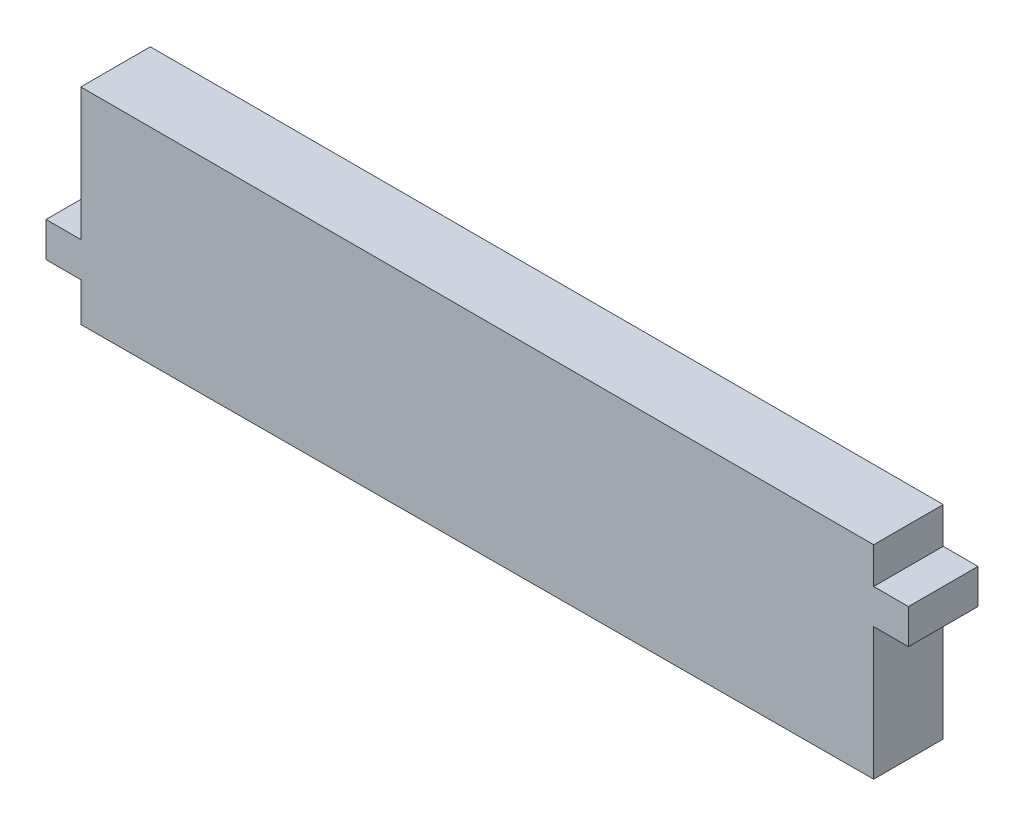
ISO-10303-21;
HEADER;
FILE_DESCRIPTION(('STEP AP214'),'2;1');
FILE_NAME('part.step','',(''),(''),'','','');
FILE_SCHEMA(('AUTOMOTIVE_DESIGN { 1 0 10303 214 1 1 1 1 }'));
ENDSEC;
DATA;
#1=APPLICATION_CONTEXT('core data for automotive mechanical design processes');
#2=APPLICATION_PROTOCOL_DEFINITION('international standard','automotive_design',2000,#1);
#3=PRODUCT_CONTEXT('',#1,'mechanical');
#4=PRODUCT('Part','Part','',(#3));
#5=PRODUCT_RELATED_PRODUCT_CATEGORY('part','',(#4));
#6=PRODUCT_DEFINITION_FORMATION('','',#4);
#7=PRODUCT_DEFINITION_CONTEXT('part definition',#1,'design');
#8=PRODUCT_DEFINITION('design','',#6,#7);
#9=PRODUCT_DEFINITION_SHAPE('','',#8);
#10=(LENGTH_UNIT() NAMED_UNIT(*) SI_UNIT(.MILLI.,.METRE.));
#11=(NAMED_UNIT(*) PLANE_ANGLE_UNIT() SI_UNIT($,.RADIAN.));
#12=(NAMED_UNIT(*) SI_UNIT($,.STERADIAN.) SOLID_ANGLE_UNIT());
#13=UNCERTAINTY_MEASURE_WITH_UNIT(LENGTH_MEASURE(1.E-05),#10,'distance_accuracy_value','');
#14=(GEOMETRIC_REPRESENTATION_CONTEXT(3) GLOBAL_UNCERTAINTY_ASSIGNED_CONTEXT((#13)) GLOBAL_UNIT_ASSIGNED_CONTEXT((#10,
#11,#12)) REPRESENTATION_CONTEXT('',''));
#15=CARTESIAN_POINT('',(0.,0.,0.));
#16=DIRECTION('',(0.,0.,1.));
#17=DIRECTION('',(1.,0.,0.));
#18=AXIS2_PLACEMENT_3D('',#15,#16,#17);
#19=CARTESIAN_POINT('',(15.8059102658461,-11.1832674981758,87.2995370130431));
#20=DIRECTION('',(1.,0.,0.));
#21=DIRECTION('',(0.,0.,-1.));
#22=AXIS2_PLACEMENT_3D('',#19,#20,#21);
#23=PLANE('',#22);
#24=DIRECTION('',(0.,-1.,0.));
#25=VECTOR('',#24,1.);
#26=CARTESIAN_POINT('',(15.8059102658461,-11.1832674981758,6.35000000000004));
#27=LINE('',#26,#25);
#28=CARTESIAN_POINT('',(15.8059102658461,-11.1832674981758,6.35000000000004));
#29=VERTEX_POINT('',#28);
#30=CARTESIAN_POINT('',(15.8059102658461,-23.2482674981757,6.35000000000004));
#31=VERTEX_POINT('',#30);
#32=EDGE_CURVE('E167',#29,#31,#27,.T.);
#33=ORIENTED_EDGE('',*,*,#32,.F.);
#34=DIRECTION('',(0.,0.,-1.));
#35=VECTOR('',#34,1.);
#36=CARTESIAN_POINT('',(15.8059102658461,-11.1832674981758,87.2995370130431));
#37=LINE('',#36,#35);
#38=CARTESIAN_POINT('',(15.8059102658461,-11.1832674981758,0.));
#39=VERTEX_POINT('',#38);
#40=EDGE_CURVE('E36',#29,#39,#37,.T.);
#41=ORIENTED_EDGE('',*,*,#40,.T.);
#42=DIRECTION('',(0.,-1.,0.));
#43=VECTOR('',#42,1.);
#44=CARTESIAN_POINT('',(15.8059102658461,-11.1832674981758,0.));
#45=LINE('',#44,#43);
#46=CARTESIAN_POINT('',(15.8059102658461,-23.2482674981757,0.));
#47=VERTEX_POINT('',#46);
#48=EDGE_CURVE('E175',#39,#47,#45,.T.);
#49=ORIENTED_EDGE('',*,*,#48,.T.);
#50=DIRECTION('',(0.,0.,-1.));
#51=VECTOR('',#50,1.);
#52=CARTESIAN_POINT('',(15.8059102658461,-23.2482674981757,87.2995370130431));
#53=LINE('',#52,#51);
#54=EDGE_CURVE('E103',#31,#47,#53,.T.);
#55=ORIENTED_EDGE('',*,*,#54,.F.);
#56=EDGE_LOOP('',(#33,#41,#49,#55));
#57=FACE_BOUND('',#56,.T.);
#58=ADVANCED_FACE('F32',(#57),#23,.F.);
#59=CARTESIAN_POINT('',(15.8059102658461,-23.2482674981757,87.2995370130431));
#60=DIRECTION('',(0.,-1.,0.));
#61=DIRECTION('',(0.,0.,-1.));
#62=AXIS2_PLACEMENT_3D('',#59,#60,#61);
#63=PLANE('',#62);
#64=DIRECTION('',(-1.,0.,0.));
#65=VECTOR('',#64,1.);
#66=CARTESIAN_POINT('',(15.8059102658461,-23.2482674981757,6.35000000000004));
#67=LINE('',#66,#65);
#68=CARTESIAN_POINT('',(12.6309102658461,-23.2482674981757,6.35000000000004));
#69=VERTEX_POINT('',#68);
#70=EDGE_CURVE('E110',#31,#69,#67,.T.);
#71=ORIENTED_EDGE('',*,*,#70,.F.);
#72=ORIENTED_EDGE('',*,*,#54,.T.);
#73=DIRECTION('',(-1.,0.,0.));
#74=VECTOR('',#73,1.);
#75=CARTESIAN_POINT('',(15.8059102658461,-23.2482674981757,0.));
#76=LINE('',#75,#74);
#77=CARTESIAN_POINT('',(12.6309102658461,-23.2482674981757,0.));
#78=VERTEX_POINT('',#77);
#79=EDGE_CURVE('E174',#47,#78,#76,.T.);
#80=ORIENTED_EDGE('',*,*,#79,.T.);
#81=DIRECTION('',(0.,0.,-1.));
#82=VECTOR('',#81,1.);
#83=CARTESIAN_POINT('',(12.6309102658461,-23.2482674981757,87.2995370130431));
#84=LINE('',#83,#82);
#85=EDGE_CURVE('E176',#69,#78,#84,.T.);
#86=ORIENTED_EDGE('',*,*,#85,.F.);
#87=EDGE_LOOP('',(#71,#72,#80,#86));
#88=FACE_BOUND('',#87,.T.);
#89=ADVANCED_FACE('F225',(#88),#63,.F.);
#90=CARTESIAN_POINT('',(12.6309102658461,-23.2482674981757,87.2995370130431));
#91=DIRECTION('',(1.,0.,0.));
#92=DIRECTION('',(0.,0.,-1.));
#93=AXIS2_PLACEMENT_3D('',#90,#91,#92);
#94=PLANE('',#93);
#95=DIRECTION('',(0.,-1.,0.));
#96=VECTOR('',#95,1.);
#97=CARTESIAN_POINT('',(12.6309102658461,-23.2482674981757,6.35000000000004));
#98=LINE('',#97,#96);
#99=CARTESIAN_POINT('',(12.6309102658461,-26.4232674981758,6.35000000000004));
#100=VERTEX_POINT('',#99);
#101=EDGE_CURVE('E163',#69,#100,#98,.T.);
#102=ORIENTED_EDGE('',*,*,#101,.F.);
#103=ORIENTED_EDGE('',*,*,#85,.T.);
#104=DIRECTION('',(0.,-1.,0.));
#105=VECTOR('',#104,1.);
#106=CARTESIAN_POINT('',(12.6309102658461,-23.2482674981757,0.));
#107=LINE('',#106,#105);
#108=CARTESIAN_POINT('',(12.6309102658461,-26.4232674981758,0.));
#109=VERTEX_POINT('',#108);
#110=EDGE_CURVE('E178',#78,#109,#107,.T.);
#111=ORIENTED_EDGE('',*,*,#110,.T.);
#112=DIRECTION('',(0.,0.,-1.));
#113=VECTOR('',#112,1.);
#114=CARTESIAN_POINT('',(12.6309102658461,-26.4232674981758,87.2995370130431));
#115=LINE('',#114,#113);
#116=EDGE_CURVE('E179',#100,#109,#115,.T.);
#117=ORIENTED_EDGE('',*,*,#116,.F.);
#118=EDGE_LOOP('',(#102,#103,#111,#117));
#119=FACE_BOUND('',#118,.T.);
#120=ADVANCED_FACE('F228',(#119),#94,.F.);
#121=CARTESIAN_POINT('',(12.6309102658461,-26.4232674981758,87.2995370130431));
#122=DIRECTION('',(0.,1.,0.));
#123=DIRECTION('',(0.,0.,1.));
#124=AXIS2_PLACEMENT_3D('',#121,#122,#123);
#125=PLANE('',#124);
#126=DIRECTION('',(1.,0.,0.));
#127=VECTOR('',#126,1.);
#128=CARTESIAN_POINT('',(12.6309102658461,-26.4232674981758,6.35000000000004));
#129=LINE('',#128,#127);
#130=CARTESIAN_POINT('',(15.8059102658461,-26.4232674981758,6.35000000000004));
#131=VERTEX_POINT('',#130);
#132=EDGE_CURVE('E160',#100,#131,#129,.T.);
#133=ORIENTED_EDGE('',*,*,#132,.F.);
#134=ORIENTED_EDGE('',*,*,#116,.T.);
#135=DIRECTION('',(1.,0.,0.));
#136=VECTOR('',#135,1.);
#137=CARTESIAN_POINT('',(12.6309102658461,-26.4232674981758,0.));
#138=LINE('',#137,#136);
#139=CARTESIAN_POINT('',(15.8059102658461,-26.4232674981758,0.));
#140=VERTEX_POINT('',#139);
#141=EDGE_CURVE('E181',#109,#140,#138,.T.);
#142=ORIENTED_EDGE('',*,*,#141,.T.);
#143=DIRECTION('',(0.,0.,-1.));
#144=VECTOR('',#143,1.);
#145=CARTESIAN_POINT('',(15.8059102658461,-26.4232674981758,87.2995370130431));
#146=LINE('',#145,#144);
#147=EDGE_CURVE('E182',#131,#140,#146,.T.);
#148=ORIENTED_EDGE('',*,*,#147,.F.);
#149=EDGE_LOOP('',(#133,#134,#142,#148));
#150=FACE_BOUND('',#149,.T.);
#151=ADVANCED_FACE('F230',(#150),#125,.F.);
#152=CARTESIAN_POINT('',(15.8059102658461,-29.9673017460691,87.2995370130431));
#153=DIRECTION('',(1.,0.,0.));
#154=DIRECTION('',(0.,0.,-1.));
#155=AXIS2_PLACEMENT_3D('',#152,#153,#154);
#156=PLANE('',#155);
#157=DIRECTION('',(0.,-1.,0.));
#158=VECTOR('',#157,1.);
#159=CARTESIAN_POINT('',(15.8059102658461,-29.9673017460691,6.35000000000004));
#160=LINE('',#159,#158);
#161=CARTESIAN_POINT('',(15.8059102658461,-29.9673017460691,6.35000000000004));
#162=VERTEX_POINT('',#161);
#163=EDGE_CURVE('E157',#131,#162,#160,.T.);
#164=ORIENTED_EDGE('',*,*,#163,.F.);
#165=ORIENTED_EDGE('',*,*,#147,.T.);
#166=DIRECTION('',(0.,-1.,0.));
#167=VECTOR('',#166,1.);
#168=CARTESIAN_POINT('',(15.8059102658461,-29.9673017460691,0.));
#169=LINE('',#168,#167);
#170=CARTESIAN_POINT('',(15.8059102658461,-29.9673017460691,0.));
#171=VERTEX_POINT('',#170);
#172=EDGE_CURVE('E184',#140,#171,#169,.T.);
#173=ORIENTED_EDGE('',*,*,#172,.T.);
#174=DIRECTION('',(0.,0.,-1.));
#175=VECTOR('',#174,1.);
#176=CARTESIAN_POINT('',(15.8059102658461,-29.9673017460691,87.2995370130431));
#177=LINE('',#176,#175);
#178=EDGE_CURVE('E185',#162,#171,#177,.T.);
#179=ORIENTED_EDGE('',*,*,#178,.F.);
#180=EDGE_LOOP('',(#164,#165,#173,#179));
#181=FACE_BOUND('',#180,.T.);
#182=ADVANCED_FACE('F234',(#181),#156,.F.);
#183=CARTESIAN_POINT('',(88.195910265846,-29.7252674981758,87.2995370130431));
#184=DIRECTION('',(-0.00334345759185495,0.999994410630045,0.));
#185=DIRECTION('',(-0.999994410630045,-0.00334345759185495,0.));
#186=AXIS2_PLACEMENT_3D('',#183,#184,#185);
#187=PLANE('',#186);
#188=DIRECTION('',(0.999994410630045,0.00334345759185495,0.));
#189=VECTOR('',#188,1.);
#190=CARTESIAN_POINT('',(88.195910265846,-29.7252674981758,6.35000000000004));
#191=LINE('',#190,#189);
#192=CARTESIAN_POINT('',(88.195910265846,-29.7252674981758,6.35000000000004));
#193=VERTEX_POINT('',#192);
#194=EDGE_CURVE('E154',#162,#193,#191,.T.);
#195=ORIENTED_EDGE('',*,*,#194,.F.);
#196=ORIENTED_EDGE('',*,*,#178,.T.);
#197=DIRECTION('',(0.999994410630045,0.00334345759185495,0.));
#198=VECTOR('',#197,1.);
#199=CARTESIAN_POINT('',(88.195910265846,-29.7252674981758,0.));
#200=LINE('',#199,#198);
#201=CARTESIAN_POINT('',(88.195910265846,-29.7252674981758,0.));
#202=VERTEX_POINT('',#201);
#203=EDGE_CURVE('E187',#171,#202,#200,.T.);
#204=ORIENTED_EDGE('',*,*,#203,.T.);
#205=DIRECTION('',(0.,0.,-1.));
#206=VECTOR('',#205,1.);
#207=CARTESIAN_POINT('',(88.195910265846,-29.7252674981758,87.2995370130431));
#208=LINE('',#207,#206);
#209=EDGE_CURVE('E188',#193,#202,#208,.T.);
#210=ORIENTED_EDGE('',*,*,#209,.F.);
#211=EDGE_LOOP('',(#195,#196,#204,#210));
#212=FACE_BOUND('',#211,.T.);
#213=ADVANCED_FACE('F239',(#212),#187,.F.);
#214=CARTESIAN_POINT('',(88.195910265846,-17.6602674981758,87.2995370130431));
#215=DIRECTION('',(-1.,0.,0.));
#216=DIRECTION('',(0.,0.,1.));
#217=AXIS2_PLACEMENT_3D('',#214,#215,#216);
#218=PLANE('',#217);
#219=DIRECTION('',(0.,1.,0.));
#220=VECTOR('',#219,1.);
#221=CARTESIAN_POINT('',(88.195910265846,-17.6602674981758,6.35000000000004));
#222=LINE('',#221,#220);
#223=CARTESIAN_POINT('',(88.195910265846,-17.6602674981758,6.35000000000004));
#224=VERTEX_POINT('',#223);
#225=EDGE_CURVE('E151',#193,#224,#222,.T.);
#226=ORIENTED_EDGE('',*,*,#225,.F.);
#227=ORIENTED_EDGE('',*,*,#209,.T.);
#228=DIRECTION('',(0.,1.,0.));
#229=VECTOR('',#228,1.);
#230=CARTESIAN_POINT('',(88.195910265846,-17.6602674981758,0.));
#231=LINE('',#230,#229);
#232=CARTESIAN_POINT('',(88.195910265846,-17.6602674981758,0.));
#233=VERTEX_POINT('',#232);
#234=EDGE_CURVE('E190',#202,#233,#231,.T.);
#235=ORIENTED_EDGE('',*,*,#234,.T.);
#236=DIRECTION('',(0.,0.,-1.));
#237=VECTOR('',#236,1.);
#238=CARTESIAN_POINT('',(88.195910265846,-17.6602674981758,87.2995370130431));
#239=LINE('',#238,#237);
#240=EDGE_CURVE('E191',#224,#233,#239,.T.);
#241=ORIENTED_EDGE('',*,*,#240,.F.);
#242=EDGE_LOOP('',(#226,#227,#235,#241));
#243=FACE_BOUND('',#242,.T.);
#244=ADVANCED_FACE('F242',(#243),#218,.F.);
#245=CARTESIAN_POINT('',(91.370910265846,-17.6602674981758,87.2995370130431));
#246=DIRECTION('',(0.,1.,0.));
#247=DIRECTION('',(0.,0.,1.));
#248=AXIS2_PLACEMENT_3D('',#245,#246,#247);
#249=PLANE('',#248);
#250=DIRECTION('',(1.,0.,0.));
#251=VECTOR('',#250,1.);
#252=CARTESIAN_POINT('',(91.370910265846,-17.6602674981758,6.35000000000004));
#253=LINE('',#252,#251);
#254=CARTESIAN_POINT('',(91.370910265846,-17.6602674981758,6.35000000000004));
#255=VERTEX_POINT('',#254);
#256=EDGE_CURVE('E146',#224,#255,#253,.T.);
#257=ORIENTED_EDGE('',*,*,#256,.F.);
#258=ORIENTED_EDGE('',*,*,#240,.T.);
#259=DIRECTION('',(1.,0.,0.));
#260=VECTOR('',#259,1.);
#261=CARTESIAN_POINT('',(91.370910265846,-17.6602674981758,0.));
#262=LINE('',#261,#260);
#263=CARTESIAN_POINT('',(91.370910265846,-17.6602674981758,0.));
#264=VERTEX_POINT('',#263);
#265=EDGE_CURVE('E193',#233,#264,#262,.T.);
#266=ORIENTED_EDGE('',*,*,#265,.T.);
#267=DIRECTION('',(0.,0.,-1.));
#268=VECTOR('',#267,1.);
#269=CARTESIAN_POINT('',(91.370910265846,-17.6602674981758,87.2995370130431));
#270=LINE('',#269,#268);
#271=EDGE_CURVE('E194',#255,#264,#270,.T.);
#272=ORIENTED_EDGE('',*,*,#271,.F.);
#273=EDGE_LOOP('',(#257,#258,#266,#272));
#274=FACE_BOUND('',#273,.T.);
#275=ADVANCED_FACE('F248',(#274),#249,.F.);
#276=CARTESIAN_POINT('',(91.370910265846,-14.4852674981758,87.2995370130431));
#277=DIRECTION('',(-1.,0.,0.));
#278=DIRECTION('',(0.,0.,1.));
#279=AXIS2_PLACEMENT_3D('',#276,#277,#278);
#280=PLANE('',#279);
#281=DIRECTION('',(0.,1.,0.));
#282=VECTOR('',#281,1.);
#283=CARTESIAN_POINT('',(91.370910265846,-14.4852674981758,6.35000000000004));
#284=LINE('',#283,#282);
#285=CARTESIAN_POINT('',(91.370910265846,-14.4852674981758,6.35000000000004));
#286=VERTEX_POINT('',#285);
#287=EDGE_CURVE('E144',#255,#286,#284,.T.);
#288=ORIENTED_EDGE('',*,*,#287,.F.);
#289=ORIENTED_EDGE('',*,*,#271,.T.);
#290=DIRECTION('',(0.,1.,0.));
#291=VECTOR('',#290,1.);
#292=CARTESIAN_POINT('',(91.370910265846,-14.4852674981758,0.));
#293=LINE('',#292,#291);
#294=CARTESIAN_POINT('',(91.370910265846,-14.4852674981758,0.));
#295=VERTEX_POINT('',#294);
#296=EDGE_CURVE('E196',#264,#295,#293,.T.);
#297=ORIENTED_EDGE('',*,*,#296,.T.);
#298=DIRECTION('',(0.,0.,-1.));
#299=VECTOR('',#298,1.);
#300=CARTESIAN_POINT('',(91.370910265846,-14.4852674981758,87.2995370130431));
#301=LINE('',#300,#299);
#302=EDGE_CURVE('E197',#286,#295,#301,.T.);
#303=ORIENTED_EDGE('',*,*,#302,.F.);
#304=EDGE_LOOP('',(#288,#289,#297,#303));
#305=FACE_BOUND('',#304,.T.);
#306=ADVANCED_FACE('F250',(#305),#280,.F.);
#307=CARTESIAN_POINT('',(88.195910265846,-14.4852674981758,87.2995370130431));
#308=DIRECTION('',(0.,-1.,0.));
#309=DIRECTION('',(0.,0.,-1.));
#310=AXIS2_PLACEMENT_3D('',#307,#308,#309);
#311=PLANE('',#310);
#312=DIRECTION('',(-1.,0.,0.));
#313=VECTOR('',#312,1.);
#314=CARTESIAN_POINT('',(88.195910265846,-14.4852674981758,6.35000000000004));
#315=LINE('',#314,#313);
#316=CARTESIAN_POINT('',(88.195910265846,-14.4852674981758,6.35000000000004));
#317=VERTEX_POINT('',#316);
#318=EDGE_CURVE('E41',#286,#317,#315,.T.);
#319=ORIENTED_EDGE('',*,*,#318,.F.);
#320=ORIENTED_EDGE('',*,*,#302,.T.);
#321=DIRECTION('',(-1.,0.,0.));
#322=VECTOR('',#321,1.);
#323=CARTESIAN_POINT('',(88.195910265846,-14.4852674981758,0.));
#324=LINE('',#323,#322);
#325=CARTESIAN_POINT('',(88.195910265846,-14.4852674981758,0.));
#326=VERTEX_POINT('',#325);
#327=EDGE_CURVE('E138',#295,#326,#324,.T.);
#328=ORIENTED_EDGE('',*,*,#327,.T.);
#329=DIRECTION('',(0.,0.,-1.));
#330=VECTOR('',#329,1.);
#331=CARTESIAN_POINT('',(88.195910265846,-14.4852674981758,87.2995370130431));
#332=LINE('',#331,#330);
#333=EDGE_CURVE('E129',#317,#326,#332,.T.);
#334=ORIENTED_EDGE('',*,*,#333,.F.);
#335=EDGE_LOOP('',(#319,#320,#328,#334));
#336=FACE_BOUND('',#335,.T.);
#337=ADVANCED_FACE('F135',(#336),#311,.F.);
#338=CARTESIAN_POINT('',(88.195910265846,-14.4852674981758,87.2995370130431));
#339=DIRECTION('',(-1.,0.,0.));
#340=DIRECTION('',(0.,0.,1.));
#341=AXIS2_PLACEMENT_3D('',#338,#339,#340);
#342=PLANE('',#341);
#343=DIRECTION('',(0.,1.,0.));
#344=VECTOR('',#343,1.);
#345=CARTESIAN_POINT('',(88.195910265846,-14.4852674981758,6.35000000000004));
#346=LINE('',#345,#344);
#347=CARTESIAN_POINT('',(88.195910265846,-11.1832674981758,6.35000000000004));
#348=VERTEX_POINT('',#347);
#349=EDGE_CURVE('E11',#317,#348,#346,.T.);
#350=ORIENTED_EDGE('',*,*,#349,.F.);
#351=ORIENTED_EDGE('',*,*,#333,.T.);
#352=DIRECTION('',(0.,1.,0.));
#353=VECTOR('',#352,1.);
#354=CARTESIAN_POINT('',(88.195910265846,-14.4852674981758,0.));
#355=LINE('',#354,#353);
#356=CARTESIAN_POINT('',(88.195910265846,-11.1832674981758,0.));
#357=VERTEX_POINT('',#356);
#358=EDGE_CURVE('E140',#326,#357,#355,.T.);
#359=ORIENTED_EDGE('',*,*,#358,.T.);
#360=DIRECTION('',(0.,0.,-1.));
#361=VECTOR('',#360,1.);
#362=CARTESIAN_POINT('',(88.195910265846,-11.1832674981758,87.2995370130431));
#363=LINE('',#362,#361);
#364=EDGE_CURVE('E54',#348,#357,#363,.T.);
#365=ORIENTED_EDGE('',*,*,#364,.F.);
#366=EDGE_LOOP('',(#350,#351,#359,#365));
#367=FACE_BOUND('',#366,.T.);
#368=ADVANCED_FACE('F128',(#367),#342,.F.);
#369=CARTESIAN_POINT('',(88.195910265846,-11.1832674981758,87.2995370130431));
#370=DIRECTION('',(0.,-1.,0.));
#371=DIRECTION('',(0.,0.,-1.));
#372=AXIS2_PLACEMENT_3D('',#369,#370,#371);
#373=PLANE('',#372);
#374=DIRECTION('',(-1.,0.,0.));
#375=VECTOR('',#374,1.);
#376=CARTESIAN_POINT('',(88.195910265846,-11.1832674981758,6.35000000000004));
#377=LINE('',#376,#375);
#378=EDGE_CURVE('E170',#348,#29,#377,.T.);
#379=ORIENTED_EDGE('',*,*,#378,.F.);
#380=ORIENTED_EDGE('',*,*,#364,.T.);
#381=DIRECTION('',(-1.,0.,0.));
#382=VECTOR('',#381,1.);
#383=CARTESIAN_POINT('',(88.195910265846,-11.1832674981758,0.));
#384=LINE('',#383,#382);
#385=EDGE_CURVE('E172',#357,#39,#384,.T.);
#386=ORIENTED_EDGE('',*,*,#385,.T.);
#387=ORIENTED_EDGE('',*,*,#40,.F.);
#388=EDGE_LOOP('',(#379,#380,#386,#387));
#389=FACE_BOUND('',#388,.T.);
#390=ADVANCED_FACE('F220',(#389),#373,.F.);
#391=CARTESIAN_POINT('',(0.,0.,0.));
#392=DIRECTION('',(0.,0.,-1.));
#393=DIRECTION('',(-1.,0.,0.));
#394=AXIS2_PLACEMENT_3D('',#391,#392,#393);
#395=PLANE('',#394);
#396=ORIENTED_EDGE('',*,*,#48,.F.);
#397=ORIENTED_EDGE('',*,*,#385,.F.);
#398=ORIENTED_EDGE('',*,*,#358,.F.);
#399=ORIENTED_EDGE('',*,*,#327,.F.);
#400=ORIENTED_EDGE('',*,*,#296,.F.);
#401=ORIENTED_EDGE('',*,*,#265,.F.);
#402=ORIENTED_EDGE('',*,*,#234,.F.);
#403=ORIENTED_EDGE('',*,*,#203,.F.);
#404=ORIENTED_EDGE('',*,*,#172,.F.);
#405=ORIENTED_EDGE('',*,*,#141,.F.);
#406=ORIENTED_EDGE('',*,*,#110,.F.);
#407=ORIENTED_EDGE('',*,*,#79,.F.);
#408=EDGE_LOOP('',(#396,#397,#398,#399,#400,#401,#402,#403,#404,#405,#406,#407));
#409=FACE_BOUND('',#408,.T.);
#410=ADVANCED_FACE('F222',(#409),#395,.T.);
#411=CARTESIAN_POINT('',(318.188719107862,-17.6602674981758,6.35000000000004));
#412=DIRECTION('',(0.,0.,1.));
#413=DIRECTION('',(1.,0.,0.));
#414=AXIS2_PLACEMENT_3D('',#411,#412,#413);
#415=PLANE('',#414);
#416=ORIENTED_EDGE('',*,*,#378,.T.);
#417=ORIENTED_EDGE('',*,*,#32,.T.);
#418=ORIENTED_EDGE('',*,*,#70,.T.);
#419=ORIENTED_EDGE('',*,*,#101,.T.);
#420=ORIENTED_EDGE('',*,*,#132,.T.);
#421=ORIENTED_EDGE('',*,*,#163,.T.);
#422=ORIENTED_EDGE('',*,*,#194,.T.);
#423=ORIENTED_EDGE('',*,*,#225,.T.);
#424=ORIENTED_EDGE('',*,*,#256,.T.);
#425=ORIENTED_EDGE('',*,*,#287,.T.);
#426=ORIENTED_EDGE('',*,*,#318,.T.);
#427=ORIENTED_EDGE('',*,*,#349,.T.);
#428=EDGE_LOOP('',(#416,#417,#418,#419,#420,#421,#422,#423,#424,#425,#426,#427));
#429=FACE_BOUND('',#428,.T.);
#430=ADVANCED_FACE('F34',(#429),#415,.T.);
#431=CLOSED_SHELL('',(#58,#89,#120,#151,#182,#213,#244,#275,#306,#337,#368,#390,#410,#430));
#432=MANIFOLD_SOLID_BREP('B2',#431);
#433=ADVANCED_BREP_SHAPE_REPRESENTATION('',(#18,#432),#14);
#434=SHAPE_DEFINITION_REPRESENTATION(#9,#433);
ENDSEC;
END-ISO-10303-21;
